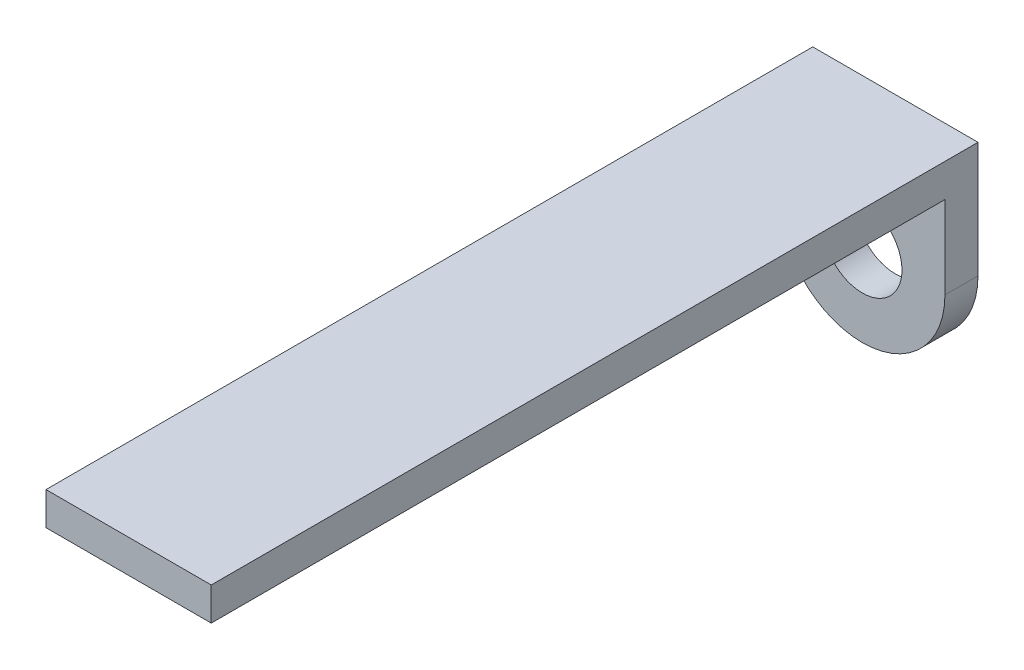
ISO-10303-21;
HEADER;
FILE_DESCRIPTION(('STEP AP214'),'2;1');
FILE_NAME('part.step','',(''),(''),'','','');
FILE_SCHEMA(('AUTOMOTIVE_DESIGN { 1 0 10303 214 1 1 1 1 }'));
ENDSEC;
DATA;
#1=APPLICATION_CONTEXT('core data for automotive mechanical design processes');
#2=APPLICATION_PROTOCOL_DEFINITION('international standard','automotive_design',2000,#1);
#3=PRODUCT_CONTEXT('',#1,'mechanical');
#4=PRODUCT('Part','Part','',(#3));
#5=PRODUCT_RELATED_PRODUCT_CATEGORY('part','',(#4));
#6=PRODUCT_DEFINITION_FORMATION('','',#4);
#7=PRODUCT_DEFINITION_CONTEXT('part definition',#1,'design');
#8=PRODUCT_DEFINITION('design','',#6,#7);
#9=PRODUCT_DEFINITION_SHAPE('','',#8);
#10=(LENGTH_UNIT() NAMED_UNIT(*) SI_UNIT(.MILLI.,.METRE.));
#11=(NAMED_UNIT(*) PLANE_ANGLE_UNIT() SI_UNIT($,.RADIAN.));
#12=(NAMED_UNIT(*) SI_UNIT($,.STERADIAN.) SOLID_ANGLE_UNIT());
#13=UNCERTAINTY_MEASURE_WITH_UNIT(LENGTH_MEASURE(1.E-05),#10,'distance_accuracy_value','');
#14=(GEOMETRIC_REPRESENTATION_CONTEXT(3) GLOBAL_UNCERTAINTY_ASSIGNED_CONTEXT((#13)) GLOBAL_UNIT_ASSIGNED_CONTEXT((#10,
#11,#12)) REPRESENTATION_CONTEXT('',''));
#15=CARTESIAN_POINT('',(0.,0.,0.));
#16=DIRECTION('',(0.,0.,1.));
#17=DIRECTION('',(1.,0.,0.));
#18=AXIS2_PLACEMENT_3D('',#15,#16,#17);
#19=CARTESIAN_POINT('',(6.74807432154978E-13,14.6,-12.0999999999999));
#20=DIRECTION('',(0.,-1.,0.));
#21=DIRECTION('',(1.,0.,0.));
#22=AXIS2_PLACEMENT_3D('',#19,#20,#21);
#23=PLANE('',#22);
#24=DIRECTION('',(0.,0.,1.));
#25=VECTOR('',#24,1.);
#26=CARTESIAN_POINT('',(-2.49999999999997,14.6,-12.0999999999999));
#27=LINE('',#26,#25);
#28=CARTESIAN_POINT('',(-2.49999999999997,14.6,-12.0999999999999));
#29=VERTEX_POINT('',#28);
#30=CARTESIAN_POINT('',(-2.49999999999997,14.5999999999999,11.1000000000001));
#31=VERTEX_POINT('',#30);
#32=EDGE_CURVE('E57',#29,#31,#27,.T.);
#33=ORIENTED_EDGE('',*,*,#32,.T.);
#34=DIRECTION('',(-1.,0.,0.));
#35=VECTOR('',#34,1.);
#36=CARTESIAN_POINT('',(6.75674793892966E-13,14.5999999999999,11.1000000000001));
#37=LINE('',#36,#35);
#38=CARTESIAN_POINT('',(2.50000000000004,14.5999999999999,11.1000000000001));
#39=VERTEX_POINT('',#38);
#40=EDGE_CURVE('E11',#39,#31,#37,.T.);
#41=ORIENTED_EDGE('',*,*,#40,.F.);
#42=DIRECTION('',(0.,0.,1.));
#43=VECTOR('',#42,1.);
#44=CARTESIAN_POINT('',(2.50000000000004,14.6,-12.0999999999999));
#45=LINE('',#44,#43);
#46=CARTESIAN_POINT('',(2.50000000000004,14.6,-12.0999999999999));
#47=VERTEX_POINT('',#46);
#48=EDGE_CURVE('E49',#47,#39,#45,.T.);
#49=ORIENTED_EDGE('',*,*,#48,.F.);
#50=DIRECTION('',(1.,0.,0.));
#51=VECTOR('',#50,1.);
#52=CARTESIAN_POINT('',(6.74807432154978E-13,14.6,-12.0999999999999));
#53=LINE('',#52,#51);
#54=EDGE_CURVE('E123',#29,#47,#53,.T.);
#55=ORIENTED_EDGE('',*,*,#54,.F.);
#56=EDGE_LOOP('',(#33,#41,#49,#55));
#57=FACE_BOUND('',#56,.T.);
#58=ADVANCED_FACE('F34',(#57),#23,.F.);
#59=CARTESIAN_POINT('',(6.78276879106932E-13,28.6,11.1000000000001));
#60=DIRECTION('',(0.,0.,1.));
#61=DIRECTION('',(0.866025403784417,-0.500000000000038,0.));
#62=AXIS2_PLACEMENT_3D('',#59,#60,#61);
#63=PLANE('',#62);
#64=DIRECTION('',(0.,1.,0.));
#65=VECTOR('',#64,1.);
#66=CARTESIAN_POINT('',(2.50000000000004,13.5999999999999,11.1000000000001));
#67=LINE('',#66,#65);
#68=CARTESIAN_POINT('',(2.50000000000004,13.5999999999999,11.1000000000001));
#69=VERTEX_POINT('',#68);
#70=EDGE_CURVE('E111',#69,#39,#67,.T.);
#71=ORIENTED_EDGE('',*,*,#70,.T.);
#72=ORIENTED_EDGE('',*,*,#40,.T.);
#73=DIRECTION('',(0.,-1.,0.));
#74=VECTOR('',#73,1.);
#75=CARTESIAN_POINT('',(-2.49999999999997,13.6000000000001,11.1000000000001));
#76=LINE('',#75,#74);
#77=CARTESIAN_POINT('',(-2.49999999999997,13.6000000000001,11.1000000000001));
#78=VERTEX_POINT('',#77);
#79=EDGE_CURVE('E117',#31,#78,#76,.T.);
#80=ORIENTED_EDGE('',*,*,#79,.T.);
#81=DIRECTION('',(1.,0.,0.));
#82=VECTOR('',#81,1.);
#83=CARTESIAN_POINT('',(2.50000000000004,13.5999999999999,11.1000000000001));
#84=LINE('',#83,#82);
#85=EDGE_CURVE('E113',#78,#69,#84,.T.);
#86=ORIENTED_EDGE('',*,*,#85,.T.);
#87=EDGE_LOOP('',(#71,#72,#80,#86));
#88=FACE_BOUND('',#87,.T.);
#89=ADVANCED_FACE('F164',(#88),#63,.T.);
#90=CARTESIAN_POINT('',(2.50000000000004,13.5999999999999,11.1000000000001));
#91=DIRECTION('',(0.,1.,0.));
#92=DIRECTION('',(-1.,0.,0.));
#93=AXIS2_PLACEMENT_3D('',#90,#91,#92);
#94=PLANE('',#93);
#95=DIRECTION('',(1.,0.,0.));
#96=VECTOR('',#95,1.);
#97=CARTESIAN_POINT('',(2.50000000000004,13.6,-11.0999999999999));
#98=LINE('',#97,#96);
#99=CARTESIAN_POINT('',(-2.49999999999997,13.6000000000002,-11.0999999999999));
#100=VERTEX_POINT('',#99);
#101=CARTESIAN_POINT('',(2.50000000000004,13.6,-11.0999999999999));
#102=VERTEX_POINT('',#101);
#103=EDGE_CURVE('E94',#100,#102,#98,.T.);
#104=ORIENTED_EDGE('',*,*,#103,.T.);
#105=DIRECTION('',(0.,0.,-1.));
#106=VECTOR('',#105,1.);
#107=CARTESIAN_POINT('',(2.50000000000004,13.5999999999999,11.1000000000001));
#108=LINE('',#107,#106);
#109=EDGE_CURVE('E106',#69,#102,#108,.T.);
#110=ORIENTED_EDGE('',*,*,#109,.F.);
#111=ORIENTED_EDGE('',*,*,#85,.F.);
#112=DIRECTION('',(0.,0.,-1.));
#113=VECTOR('',#112,1.);
#114=CARTESIAN_POINT('',(-2.49999999999997,13.6000000000001,11.1000000000001));
#115=LINE('',#114,#113);
#116=EDGE_CURVE('E42',#78,#100,#115,.T.);
#117=ORIENTED_EDGE('',*,*,#116,.T.);
#118=EDGE_LOOP('',(#104,#110,#111,#117));
#119=FACE_BOUND('',#118,.T.);
#120=ADVANCED_FACE('F104',(#119),#94,.F.);
#121=CARTESIAN_POINT('',(0.,11.1000000000001,-11.1));
#122=DIRECTION('',(0.,0.,-1.));
#123=DIRECTION('',(-0.866025403784417,0.500000000000038,0.));
#124=AXIS2_PLACEMENT_3D('',#121,#122,#123);
#125=PLANE('',#124);
#126=CARTESIAN_POINT('',(0.,11.1000000000001,-11.1));
#127=DIRECTION('',(0.,0.,-1.));
#128=DIRECTION('',(-0.866025403784417,0.500000000000038,0.));
#129=AXIS2_PLACEMENT_3D('',#126,#127,#128);
#130=CIRCLE('',#129,1.2);
#131=CARTESIAN_POINT('',(-1.0392304845413,11.7000000000001,-11.1));
#132=VERTEX_POINT('',#131);
#133=EDGE_CURVE('E136',#132,#132,#130,.T.);
#134=ORIENTED_EDGE('',*,*,#133,.T.);
#135=EDGE_LOOP('',(#134));
#136=FACE_BOUND('',#135,.T.);
#137=ORIENTED_EDGE('',*,*,#103,.F.);
#138=DIRECTION('',(0.,1.,0.));
#139=VECTOR('',#138,1.);
#140=CARTESIAN_POINT('',(-2.49999999999997,13.6000000000002,-11.0999999999999));
#141=LINE('',#140,#139);
#142=CARTESIAN_POINT('',(-2.5,11.1000000000002,-11.1));
#143=VERTEX_POINT('',#142);
#144=EDGE_CURVE('E131',#143,#100,#141,.T.);
#145=ORIENTED_EDGE('',*,*,#144,.F.);
#146=CARTESIAN_POINT('',(0.,11.1000000000001,-11.1));
#147=DIRECTION('',(0.,0.,-1.));
#148=DIRECTION('',(-0.866025403784417,0.500000000000038,0.));
#149=AXIS2_PLACEMENT_3D('',#146,#147,#148);
#150=CIRCLE('',#149,2.5);
#151=CARTESIAN_POINT('',(2.5,11.1,-11.1));
#152=VERTEX_POINT('',#151);
#153=EDGE_CURVE('E97',#152,#143,#150,.T.);
#154=ORIENTED_EDGE('',*,*,#153,.F.);
#155=DIRECTION('',(0.,-1.,0.));
#156=VECTOR('',#155,1.);
#157=CARTESIAN_POINT('',(2.50000000000004,13.6,-11.0999999999999));
#158=LINE('',#157,#156);
#159=EDGE_CURVE('E90',#102,#152,#158,.T.);
#160=ORIENTED_EDGE('',*,*,#159,.F.);
#161=EDGE_LOOP('',(#137,#145,#154,#160));
#162=FACE_BOUND('',#161,.T.);
#163=ADVANCED_FACE('F92',(#136,#162),#125,.F.);
#164=CARTESIAN_POINT('',(0.,11.1000000000001,-11.1));
#165=DIRECTION('',(0.,0.,-1.));
#166=DIRECTION('',(-0.866025403784417,0.500000000000038,0.));
#167=AXIS2_PLACEMENT_3D('',#164,#165,#166);
#168=CYLINDRICAL_SURFACE('',#167,1.2);
#169=ORIENTED_EDGE('',*,*,#133,.F.);
#170=EDGE_LOOP('',(#169));
#171=FACE_BOUND('',#170,.T.);
#172=CARTESIAN_POINT('',(0.,11.1000000000001,-12.1));
#173=DIRECTION('',(0.,0.,-1.));
#174=DIRECTION('',(-0.866025403784417,0.500000000000038,0.));
#175=AXIS2_PLACEMENT_3D('',#172,#173,#174);
#176=CIRCLE('',#175,1.2);
#177=CARTESIAN_POINT('',(-1.0392304845413,11.7000000000001,-12.1));
#178=VERTEX_POINT('',#177);
#179=EDGE_CURVE('E139',#178,#178,#176,.T.);
#180=ORIENTED_EDGE('',*,*,#179,.T.);
#181=EDGE_LOOP('',(#180));
#182=FACE_BOUND('',#181,.T.);
#183=ADVANCED_FACE('F146',(#171,#182),#168,.F.);
#184=CARTESIAN_POINT('',(0.,11.1000000000001,-11.1));
#185=DIRECTION('',(0.,0.,-1.));
#186=DIRECTION('',(-0.866025403784417,0.500000000000038,0.));
#187=AXIS2_PLACEMENT_3D('',#184,#185,#186);
#188=CYLINDRICAL_SURFACE('',#187,2.5);
#189=CARTESIAN_POINT('',(0.,11.1000000000001,-12.1));
#190=DIRECTION('',(0.,0.,-1.));
#191=DIRECTION('',(-0.866025403784417,0.500000000000038,0.));
#192=AXIS2_PLACEMENT_3D('',#189,#190,#191);
#193=CIRCLE('',#192,2.5);
#194=CARTESIAN_POINT('',(2.5,11.1,-12.1));
#195=VERTEX_POINT('',#194);
#196=CARTESIAN_POINT('',(-2.5,11.1000000000002,-12.1));
#197=VERTEX_POINT('',#196);
#198=EDGE_CURVE('E108',#195,#197,#193,.T.);
#199=ORIENTED_EDGE('',*,*,#198,.F.);
#200=DIRECTION('',(0.,0.,-1.));
#201=VECTOR('',#200,1.);
#202=CARTESIAN_POINT('',(2.5,11.1,-11.1));
#203=LINE('',#202,#201);
#204=EDGE_CURVE('E129',#152,#195,#203,.T.);
#205=ORIENTED_EDGE('',*,*,#204,.F.);
#206=ORIENTED_EDGE('',*,*,#153,.T.);
#207=DIRECTION('',(0.,0.,-1.));
#208=VECTOR('',#207,1.);
#209=CARTESIAN_POINT('',(-2.5,11.1000000000002,-11.1));
#210=LINE('',#209,#208);
#211=EDGE_CURVE('E128',#143,#197,#210,.T.);
#212=ORIENTED_EDGE('',*,*,#211,.T.);
#213=EDGE_LOOP('',(#199,#205,#206,#212));
#214=FACE_BOUND('',#213,.T.);
#215=ADVANCED_FACE('F149',(#214),#188,.T.);
#216=CARTESIAN_POINT('',(2.50000000000004,13.5999999999999,11.1000000000001));
#217=DIRECTION('',(-1.,0.,0.));
#218=DIRECTION('',(0.,-1.,0.));
#219=AXIS2_PLACEMENT_3D('',#216,#217,#218);
#220=PLANE('',#219);
#221=ORIENTED_EDGE('',*,*,#48,.T.);
#222=ORIENTED_EDGE('',*,*,#70,.F.);
#223=ORIENTED_EDGE('',*,*,#109,.T.);
#224=ORIENTED_EDGE('',*,*,#159,.T.);
#225=ORIENTED_EDGE('',*,*,#204,.T.);
#226=DIRECTION('',(0.,-1.,0.));
#227=VECTOR('',#226,1.);
#228=CARTESIAN_POINT('',(2.50000000000004,28.6000000000001,-12.0999999999999));
#229=LINE('',#228,#227);
#230=EDGE_CURVE('E121',#47,#195,#229,.T.);
#231=ORIENTED_EDGE('',*,*,#230,.F.);
#232=EDGE_LOOP('',(#221,#222,#223,#224,#225,#231));
#233=FACE_BOUND('',#232,.T.);
#234=ADVANCED_FACE('F110',(#233),#220,.F.);
#235=CARTESIAN_POINT('',(-2.49999999999997,13.6000000000001,11.1000000000001));
#236=DIRECTION('',(1.,0.,0.));
#237=DIRECTION('',(0.,1.,0.));
#238=AXIS2_PLACEMENT_3D('',#235,#236,#237);
#239=PLANE('',#238);
#240=ORIENTED_EDGE('',*,*,#79,.F.);
#241=ORIENTED_EDGE('',*,*,#32,.F.);
#242=DIRECTION('',(0.,1.,0.));
#243=VECTOR('',#242,1.);
#244=CARTESIAN_POINT('',(-2.49999999999993,28.6000000000001,-12.0999999999999));
#245=LINE('',#244,#243);
#246=EDGE_CURVE('E125',#197,#29,#245,.T.);
#247=ORIENTED_EDGE('',*,*,#246,.F.);
#248=ORIENTED_EDGE('',*,*,#211,.F.);
#249=ORIENTED_EDGE('',*,*,#144,.T.);
#250=ORIENTED_EDGE('',*,*,#116,.F.);
#251=EDGE_LOOP('',(#240,#241,#247,#248,#249,#250));
#252=FACE_BOUND('',#251,.T.);
#253=ADVANCED_FACE('F36',(#252),#239,.F.);
#254=CARTESIAN_POINT('',(6.78276879106932E-13,28.6000000000001,-12.0999999999999));
#255=DIRECTION('',(0.,0.,-1.));
#256=DIRECTION('',(-0.866025403784417,0.500000000000038,0.));
#257=AXIS2_PLACEMENT_3D('',#254,#255,#256);
#258=PLANE('',#257);
#259=ORIENTED_EDGE('',*,*,#246,.T.);
#260=ORIENTED_EDGE('',*,*,#54,.T.);
#261=ORIENTED_EDGE('',*,*,#230,.T.);
#262=ORIENTED_EDGE('',*,*,#198,.T.);
#263=EDGE_LOOP('',(#259,#260,#261,#262));
#264=FACE_BOUND('',#263,.T.);
#265=ORIENTED_EDGE('',*,*,#179,.F.);
#266=EDGE_LOOP('',(#265));
#267=FACE_BOUND('',#266,.T.);
#268=ADVANCED_FACE('F153',(#264,#267),#258,.T.);
#269=CLOSED_SHELL('',(#58,#89,#120,#163,#183,#215,#234,#253,#268));
#270=MANIFOLD_SOLID_BREP('B2',#269);
#271=ADVANCED_BREP_SHAPE_REPRESENTATION('',(#18,#270),#14);
#272=SHAPE_DEFINITION_REPRESENTATION(#9,#271);
ENDSEC;
END-ISO-10303-21;
